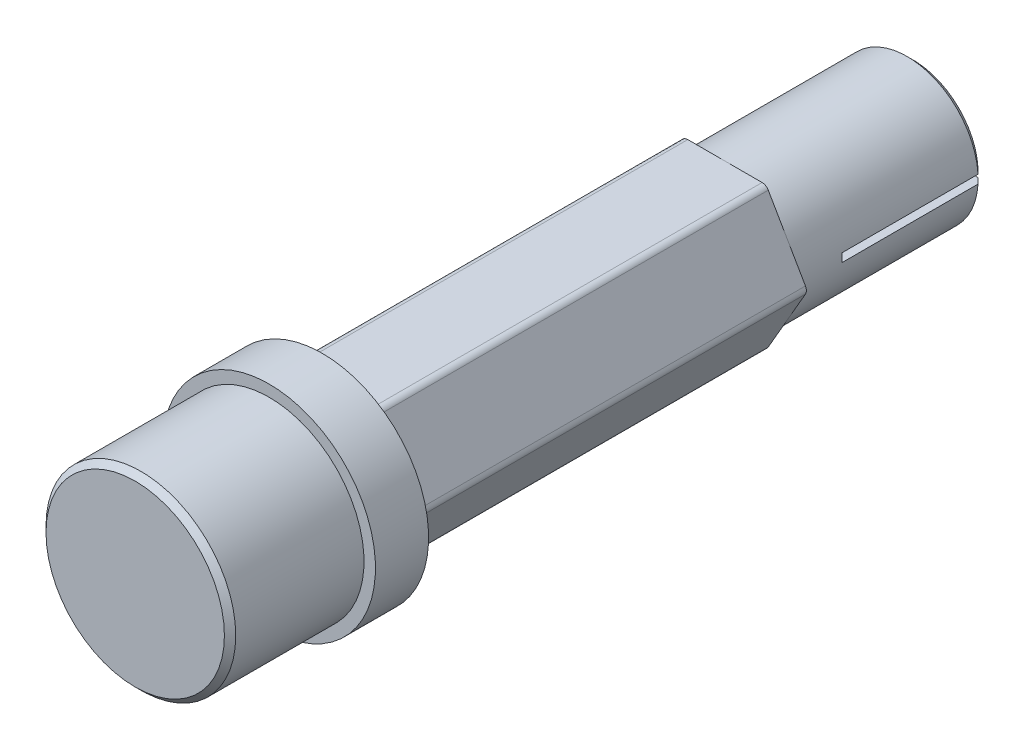
ISO-10303-21;
HEADER;
FILE_DESCRIPTION(('STEP AP214'),'2;1');
FILE_NAME('part.step','',(''),(''),'','','');
FILE_SCHEMA(('AUTOMOTIVE_DESIGN { 1 0 10303 214 1 1 1 1 }'));
ENDSEC;
DATA;
#1=APPLICATION_CONTEXT('core data for automotive mechanical design processes');
#2=APPLICATION_PROTOCOL_DEFINITION('international standard','automotive_design',2000,#1);
#3=PRODUCT_CONTEXT('',#1,'mechanical');
#4=PRODUCT('Part','Part','',(#3));
#5=PRODUCT_RELATED_PRODUCT_CATEGORY('part','',(#4));
#6=PRODUCT_DEFINITION_FORMATION('','',#4);
#7=PRODUCT_DEFINITION_CONTEXT('part definition',#1,'design');
#8=PRODUCT_DEFINITION('design','',#6,#7);
#9=PRODUCT_DEFINITION_SHAPE('','',#8);
#10=(LENGTH_UNIT() NAMED_UNIT(*) SI_UNIT(.MILLI.,.METRE.));
#11=(NAMED_UNIT(*) PLANE_ANGLE_UNIT() SI_UNIT($,.RADIAN.));
#12=(NAMED_UNIT(*) SI_UNIT($,.STERADIAN.) SOLID_ANGLE_UNIT());
#13=UNCERTAINTY_MEASURE_WITH_UNIT(LENGTH_MEASURE(1.E-05),#10,'distance_accuracy_value','');
#14=(GEOMETRIC_REPRESENTATION_CONTEXT(3) GLOBAL_UNCERTAINTY_ASSIGNED_CONTEXT((#13)) GLOBAL_UNIT_ASSIGNED_CONTEXT((#10,
#11,#12)) REPRESENTATION_CONTEXT('',''));
#15=CARTESIAN_POINT('',(0.,0.,0.));
#16=DIRECTION('',(0.,0.,1.));
#17=DIRECTION('',(1.,0.,0.));
#18=AXIS2_PLACEMENT_3D('',#15,#16,#17);
#19=CARTESIAN_POINT('',(0.,6.35000000000001,-69.67705));
#20=DIRECTION('',(0.,0.,-1.));
#21=DIRECTION('',(-1.,0.,0.));
#22=AXIS2_PLACEMENT_3D('',#19,#20,#21);
#23=PLANE('',#22);
#24=DIRECTION('',(-1.,0.,0.));
#25=VECTOR('',#24,1.);
#26=CARTESIAN_POINT('',(8.99873414352674,-0.381,-69.67705));
#27=LINE('',#26,#25);
#28=CARTESIAN_POINT('',(5.82956284810449,-0.381,-69.67705));
#29=VERTEX_POINT('',#28);
#30=CARTESIAN_POINT('',(3.15205710608168,-0.381,-69.67705));
#31=VERTEX_POINT('',#30);
#32=EDGE_CURVE('E213',#29,#31,#27,.T.);
#33=ORIENTED_EDGE('',*,*,#32,.F.);
#34=CARTESIAN_POINT('',(0.,0.,-69.67705));
#35=DIRECTION('',(0.,0.,-1.));
#36=DIRECTION('',(-1.,0.,0.));
#37=AXIS2_PLACEMENT_3D('',#34,#35,#36);
#38=CIRCLE('',#37,5.84200000000001);
#39=CARTESIAN_POINT('',(-5.82956284810449,-0.381,-69.67705));
#40=VERTEX_POINT('',#39);
#41=EDGE_CURVE('E344',#29,#40,#38,.T.);
#42=ORIENTED_EDGE('',*,*,#41,.T.);
#43=DIRECTION('',(-1.,0.,0.));
#44=VECTOR('',#43,1.);
#45=CARTESIAN_POINT('',(-3.15205710608168,-0.381,-69.67705));
#46=LINE('',#45,#44);
#47=CARTESIAN_POINT('',(-3.15205710608168,-0.381,-69.67705));
#48=VERTEX_POINT('',#47);
#49=EDGE_CURVE('E472',#48,#40,#46,.T.);
#50=ORIENTED_EDGE('',*,*,#49,.F.);
#51=CARTESIAN_POINT('',(0.,0.,-69.67705));
#52=DIRECTION('',(0.,0.,-1.));
#53=DIRECTION('',(-1.,0.,0.));
#54=AXIS2_PLACEMENT_3D('',#51,#52,#53);
#55=CIRCLE('',#54,3.17500000000001);
#56=EDGE_CURVE('E221',#31,#48,#55,.T.);
#57=ORIENTED_EDGE('',*,*,#56,.F.);
#58=EDGE_LOOP('',(#33,#42,#50,#57));
#59=FACE_BOUND('',#58,.T.);
#60=ADVANCED_FACE('F38',(#59),#23,.T.);
#61=CARTESIAN_POINT('',(0.,0.,0.));
#62=DIRECTION('',(0.,0.,1.));
#63=DIRECTION('',(1.,0.,0.));
#64=AXIS2_PLACEMENT_3D('',#61,#62,#63);
#65=PLANE('',#64);
#66=CARTESIAN_POINT('',(0.,0.,0.));
#67=DIRECTION('',(0.,0.,1.));
#68=DIRECTION('',(1.,0.,0.));
#69=AXIS2_PLACEMENT_3D('',#66,#67,#68);
#70=CIRCLE('',#69,7.992);
#71=CARTESIAN_POINT('',(7.992,0.,0.));
#72=VERTEX_POINT('',#71);
#73=EDGE_CURVE('E13',#72,#72,#70,.T.);
#74=ORIENTED_EDGE('',*,*,#73,.T.);
#75=EDGE_LOOP('',(#74));
#76=FACE_BOUND('',#75,.T.);
#77=ADVANCED_FACE('F425',(#76),#65,.T.);
#78=CARTESIAN_POINT('',(0.,0.,0.));
#79=DIRECTION('',(0.,0.,-1.));
#80=DIRECTION('',(-1.,0.,0.));
#81=AXIS2_PLACEMENT_3D('',#78,#79,#80);
#82=CYLINDRICAL_SURFACE('',#81,8.5);
#83=CARTESIAN_POINT('',(0.,0.,-0.508));
#84=DIRECTION('',(0.,0.,1.));
#85=DIRECTION('',(1.,0.,0.));
#86=AXIS2_PLACEMENT_3D('',#83,#84,#85);
#87=CIRCLE('',#86,8.5);
#88=CARTESIAN_POINT('',(8.5,0.,-0.508));
#89=VERTEX_POINT('',#88);
#90=EDGE_CURVE('E46',#89,#89,#87,.F.);
#91=ORIENTED_EDGE('',*,*,#90,.T.);
#92=EDGE_LOOP('',(#91));
#93=FACE_BOUND('',#92,.T.);
#94=CARTESIAN_POINT('',(0.,0.,-12.));
#95=DIRECTION('',(0.,0.,-1.));
#96=DIRECTION('',(-1.,0.,0.));
#97=AXIS2_PLACEMENT_3D('',#94,#95,#96);
#98=CIRCLE('',#97,8.5);
#99=CARTESIAN_POINT('',(-8.5,0.,-12.));
#100=VERTEX_POINT('',#99);
#101=EDGE_CURVE('E276',#100,#100,#98,.T.);
#102=ORIENTED_EDGE('',*,*,#101,.F.);
#103=EDGE_LOOP('',(#102));
#104=FACE_BOUND('',#103,.T.);
#105=ADVANCED_FACE('F421',(#93,#104),#82,.T.);
#106=CARTESIAN_POINT('',(0.,8.5,-12.));
#107=DIRECTION('',(0.,0.,1.));
#108=DIRECTION('',(1.,0.,0.));
#109=AXIS2_PLACEMENT_3D('',#106,#107,#108);
#110=PLANE('',#109);
#111=ORIENTED_EDGE('',*,*,#101,.T.);
#112=EDGE_LOOP('',(#111));
#113=FACE_BOUND('',#112,.T.);
#114=CARTESIAN_POINT('',(0.,0.,-12.));
#115=DIRECTION('',(0.,0.,-1.));
#116=DIRECTION('',(-1.,0.,0.));
#117=AXIS2_PLACEMENT_3D('',#114,#115,#116);
#118=CIRCLE('',#117,9.525);
#119=CARTESIAN_POINT('',(-9.525,0.,-12.));
#120=VERTEX_POINT('',#119);
#121=EDGE_CURVE('E273',#120,#120,#118,.T.);
#122=ORIENTED_EDGE('',*,*,#121,.F.);
#123=EDGE_LOOP('',(#122));
#124=FACE_BOUND('',#123,.T.);
#125=ADVANCED_FACE('F417',(#113,#124),#110,.T.);
#126=CARTESIAN_POINT('',(0.,0.,0.));
#127=DIRECTION('',(0.,0.,-1.));
#128=DIRECTION('',(-1.,0.,0.));
#129=AXIS2_PLACEMENT_3D('',#126,#127,#128);
#130=CYLINDRICAL_SURFACE('',#129,9.525);
#131=ORIENTED_EDGE('',*,*,#121,.T.);
#132=EDGE_LOOP('',(#131));
#133=FACE_BOUND('',#132,.T.);
#134=CARTESIAN_POINT('',(0.,0.,-16.7625));
#135=DIRECTION('',(0.,0.,-1.));
#136=DIRECTION('',(-1.,0.,0.));
#137=AXIS2_PLACEMENT_3D('',#134,#135,#136);
#138=CIRCLE('',#137,9.525);
#139=CARTESIAN_POINT('',(-9.525,0.,-16.7625));
#140=VERTEX_POINT('',#139);
#141=EDGE_CURVE('E268',#140,#140,#138,.T.);
#142=ORIENTED_EDGE('',*,*,#141,.F.);
#143=EDGE_LOOP('',(#142));
#144=FACE_BOUND('',#143,.T.);
#145=ADVANCED_FACE('F413',(#133,#144),#130,.T.);
#146=CARTESIAN_POINT('',(0.,9.525,-16.7625));
#147=DIRECTION('',(0.,0.,-1.));
#148=DIRECTION('',(-1.,0.,0.));
#149=AXIS2_PLACEMENT_3D('',#146,#147,#148);
#150=PLANE('',#149);
#151=ORIENTED_EDGE('',*,*,#141,.T.);
#152=EDGE_LOOP('',(#151));
#153=FACE_BOUND('',#152,.T.);
#154=DIRECTION('',(0.5,0.866025403784439,0.));
#155=VECTOR('',#154,1.);
#156=CARTESIAN_POINT('',(-7.3939401454254,0.,-16.7625));
#157=LINE('',#156,#155);
#158=CARTESIAN_POINT('',(-7.21063143495769,0.317500000000003,-16.7625));
#159=VERTEX_POINT('',#158);
#160=CARTESIAN_POINT('',(-3.8802787831804,6.08584,-16.7625));
#161=VERTEX_POINT('',#160);
#162=EDGE_CURVE('E246',#159,#161,#157,.T.);
#163=ORIENTED_EDGE('',*,*,#162,.F.);
#164=CARTESIAN_POINT('',(-6.66070530355457,0.,-16.7625));
#165=DIRECTION('',(0.,0.,-1.));
#166=DIRECTION('',(-1.,0.,0.));
#167=AXIS2_PLACEMENT_3D('',#164,#165,#166);
#168=CIRCLE('',#167,0.635);
#169=CARTESIAN_POINT('',(-7.21063143495769,-0.317499999999997,-16.7625));
#170=VERTEX_POINT('',#169);
#171=EDGE_CURVE('E325',#159,#170,#168,.F.);
#172=ORIENTED_EDGE('',*,*,#171,.T.);
#173=DIRECTION('',(-0.5,0.866025403784439,0.));
#174=VECTOR('',#173,1.);
#175=CARTESIAN_POINT('',(-3.6969700727127,-6.40334,-16.7625));
#176=LINE('',#175,#174);
#177=CARTESIAN_POINT('',(-3.88027878318041,-6.08584,-16.7625));
#178=VERTEX_POINT('',#177);
#179=EDGE_CURVE('E498',#178,#170,#176,.T.);
#180=ORIENTED_EDGE('',*,*,#179,.F.);
#181=CARTESIAN_POINT('',(-3.33035265177729,-5.76834,-16.7625));
#182=DIRECTION('',(0.,0.,-1.));
#183=DIRECTION('',(-1.,0.,0.));
#184=AXIS2_PLACEMENT_3D('',#181,#182,#183);
#185=CIRCLE('',#184,0.635);
#186=CARTESIAN_POINT('',(-3.33035265177729,-6.40334,-16.7625));
#187=VERTEX_POINT('',#186);
#188=EDGE_CURVE('E327',#178,#187,#185,.F.);
#189=ORIENTED_EDGE('',*,*,#188,.T.);
#190=DIRECTION('',(-1.,0.,0.));
#191=VECTOR('',#190,1.);
#192=CARTESIAN_POINT('',(3.6969700727127,-6.40334,-16.7625));
#193=LINE('',#192,#191);
#194=CARTESIAN_POINT('',(3.33035265177728,-6.40334,-16.7625));
#195=VERTEX_POINT('',#194);
#196=EDGE_CURVE('E259',#195,#187,#193,.T.);
#197=ORIENTED_EDGE('',*,*,#196,.F.);
#198=CARTESIAN_POINT('',(3.33035265177728,-5.76834,-16.7625));
#199=DIRECTION('',(0.,0.,-1.));
#200=DIRECTION('',(-1.,0.,0.));
#201=AXIS2_PLACEMENT_3D('',#198,#199,#200);
#202=CIRCLE('',#201,0.635);
#203=CARTESIAN_POINT('',(3.8802787831804,-6.08584,-16.7625));
#204=VERTEX_POINT('',#203);
#205=EDGE_CURVE('E329',#195,#204,#202,.F.);
#206=ORIENTED_EDGE('',*,*,#205,.T.);
#207=DIRECTION('',(-0.5,-0.866025403784438,0.));
#208=VECTOR('',#207,1.);
#209=CARTESIAN_POINT('',(7.3939401454254,0.,-16.7625));
#210=LINE('',#209,#208);
#211=CARTESIAN_POINT('',(7.21063143495769,-0.317500000000005,-16.7625));
#212=VERTEX_POINT('',#211);
#213=EDGE_CURVE('E255',#212,#204,#210,.T.);
#214=ORIENTED_EDGE('',*,*,#213,.F.);
#215=CARTESIAN_POINT('',(6.66070530355457,0.,-16.7625));
#216=DIRECTION('',(0.,0.,-1.));
#217=DIRECTION('',(-1.,0.,0.));
#218=AXIS2_PLACEMENT_3D('',#215,#216,#217);
#219=CIRCLE('',#218,0.635);
#220=CARTESIAN_POINT('',(7.21063143495769,0.317499999999994,-16.7625));
#221=VERTEX_POINT('',#220);
#222=EDGE_CURVE('E331',#212,#221,#219,.F.);
#223=ORIENTED_EDGE('',*,*,#222,.T.);
#224=DIRECTION('',(0.5,-0.866025403784439,0.));
#225=VECTOR('',#224,1.);
#226=CARTESIAN_POINT('',(3.6969700727127,6.40334,-16.7625));
#227=LINE('',#226,#225);
#228=CARTESIAN_POINT('',(3.88027878318041,6.08584,-16.7625));
#229=VERTEX_POINT('',#228);
#230=EDGE_CURVE('E252',#229,#221,#227,.T.);
#231=ORIENTED_EDGE('',*,*,#230,.F.);
#232=CARTESIAN_POINT('',(3.33035265177729,5.76834,-16.7625));
#233=DIRECTION('',(0.,0.,-1.));
#234=DIRECTION('',(-1.,0.,0.));
#235=AXIS2_PLACEMENT_3D('',#232,#233,#234);
#236=CIRCLE('',#235,0.635);
#237=CARTESIAN_POINT('',(3.33035265177729,6.40334,-16.7625));
#238=VERTEX_POINT('',#237);
#239=EDGE_CURVE('E321',#229,#238,#236,.F.);
#240=ORIENTED_EDGE('',*,*,#239,.T.);
#241=DIRECTION('',(1.,0.,0.));
#242=VECTOR('',#241,1.);
#243=CARTESIAN_POINT('',(-3.6969700727127,6.40334,-16.7625));
#244=LINE('',#243,#242);
#245=CARTESIAN_POINT('',(-3.33035265177728,6.40334,-16.7625));
#246=VERTEX_POINT('',#245);
#247=EDGE_CURVE('E249',#246,#238,#244,.T.);
#248=ORIENTED_EDGE('',*,*,#247,.F.);
#249=CARTESIAN_POINT('',(-3.33035265177728,5.76834,-16.7625));
#250=DIRECTION('',(0.,0.,-1.));
#251=DIRECTION('',(-1.,0.,0.));
#252=AXIS2_PLACEMENT_3D('',#249,#250,#251);
#253=CIRCLE('',#252,0.635);
#254=EDGE_CURVE('E323',#246,#161,#253,.F.);
#255=ORIENTED_EDGE('',*,*,#254,.T.);
#256=EDGE_LOOP('',(#163,#172,#180,#189,#197,#206,#214,#223,#231,#240,#248,#255));
#257=FACE_BOUND('',#256,.T.);
#258=ADVANCED_FACE('F371',(#153,#257),#150,.T.);
#259=CARTESIAN_POINT('',(-3.6969700727127,-6.40334,-80.0470260468395));
#260=DIRECTION('',(0.866025403784439,0.5,0.));
#261=DIRECTION('',(-0.5,0.866025403784439,0.));
#262=AXIS2_PLACEMENT_3D('',#259,#260,#261);
#263=PLANE('',#262);
#264=ORIENTED_EDGE('',*,*,#179,.T.);
#265=DIRECTION('',(0.,0.,1.));
#266=VECTOR('',#265,1.);
#267=CARTESIAN_POINT('',(-7.21063143495769,-0.317499999999997,-80.0470260468395));
#268=LINE('',#267,#266);
#269=CARTESIAN_POINT('',(-7.21063143495769,-0.317499999999995,-52.83685));
#270=VERTEX_POINT('',#269);
#271=EDGE_CURVE('E309',#170,#270,#268,.F.);
#272=ORIENTED_EDGE('',*,*,#271,.T.);
#273=DIRECTION('',(-0.5,0.866025403784439,0.));
#274=VECTOR('',#273,1.);
#275=CARTESIAN_POINT('',(-3.6969700727127,-6.40334,-52.83685));
#276=LINE('',#275,#274);
#277=CARTESIAN_POINT('',(-3.88027878318041,-6.08584,-52.83685));
#278=VERTEX_POINT('',#277);
#279=EDGE_CURVE('E495',#278,#270,#276,.T.);
#280=ORIENTED_EDGE('',*,*,#279,.F.);
#281=DIRECTION('',(0.,0.,1.));
#282=VECTOR('',#281,1.);
#283=CARTESIAN_POINT('',(-3.88027878318041,-6.08584,-80.0470260468395));
#284=LINE('',#283,#282);
#285=EDGE_CURVE('E306',#278,#178,#284,.T.);
#286=ORIENTED_EDGE('',*,*,#285,.T.);
#287=EDGE_LOOP('',(#264,#272,#280,#286));
#288=FACE_BOUND('',#287,.T.);
#289=ADVANCED_FACE('F367',(#288),#263,.F.);
#290=CARTESIAN_POINT('',(3.6969700727127,-6.40334,-80.0470260468395));
#291=DIRECTION('',(0.,1.,0.));
#292=DIRECTION('',(-1.,0.,0.));
#293=AXIS2_PLACEMENT_3D('',#290,#291,#292);
#294=PLANE('',#293);
#295=ORIENTED_EDGE('',*,*,#196,.T.);
#296=DIRECTION('',(0.,0.,1.));
#297=VECTOR('',#296,1.);
#298=CARTESIAN_POINT('',(-3.33035265177729,-6.40334,-80.0470260468395));
#299=LINE('',#298,#297);
#300=CARTESIAN_POINT('',(-3.33035265177729,-6.40334,-52.83685));
#301=VERTEX_POINT('',#300);
#302=EDGE_CURVE('E314',#187,#301,#299,.F.);
#303=ORIENTED_EDGE('',*,*,#302,.T.);
#304=DIRECTION('',(-1.,0.,0.));
#305=VECTOR('',#304,1.);
#306=CARTESIAN_POINT('',(3.6969700727127,-6.40334,-52.83685));
#307=LINE('',#306,#305);
#308=CARTESIAN_POINT('',(3.33035265177728,-6.40334,-52.83685));
#309=VERTEX_POINT('',#308);
#310=EDGE_CURVE('E231',#309,#301,#307,.T.);
#311=ORIENTED_EDGE('',*,*,#310,.F.);
#312=DIRECTION('',(0.,0.,1.));
#313=VECTOR('',#312,1.);
#314=CARTESIAN_POINT('',(3.33035265177728,-6.40334,-80.0470260468395));
#315=LINE('',#314,#313);
#316=EDGE_CURVE('E311',#309,#195,#315,.T.);
#317=ORIENTED_EDGE('',*,*,#316,.T.);
#318=EDGE_LOOP('',(#295,#303,#311,#317));
#319=FACE_BOUND('',#318,.T.);
#320=ADVANCED_FACE('F370',(#319),#294,.F.);
#321=CARTESIAN_POINT('',(7.3939401454254,0.,-80.0470260468395));
#322=DIRECTION('',(-0.866025403784438,0.5,0.));
#323=DIRECTION('',(-0.5,-0.866025403784439,0.));
#324=AXIS2_PLACEMENT_3D('',#321,#322,#323);
#325=PLANE('',#324);
#326=ORIENTED_EDGE('',*,*,#213,.T.);
#327=DIRECTION('',(0.,0.,1.));
#328=VECTOR('',#327,1.);
#329=CARTESIAN_POINT('',(3.8802787831804,-6.08584,-80.0470260468395));
#330=LINE('',#329,#328);
#331=CARTESIAN_POINT('',(3.8802787831804,-6.08584,-52.83685));
#332=VERTEX_POINT('',#331);
#333=EDGE_CURVE('E319',#204,#332,#330,.F.);
#334=ORIENTED_EDGE('',*,*,#333,.T.);
#335=DIRECTION('',(-0.5,-0.866025403784439,0.));
#336=VECTOR('',#335,1.);
#337=CARTESIAN_POINT('',(7.3939401454254,0.,-52.83685));
#338=LINE('',#337,#336);
#339=CARTESIAN_POINT('',(7.21063143495769,-0.317500000000005,-52.83685));
#340=VERTEX_POINT('',#339);
#341=EDGE_CURVE('E233',#340,#332,#338,.T.);
#342=ORIENTED_EDGE('',*,*,#341,.F.);
#343=DIRECTION('',(0.,0.,1.));
#344=VECTOR('',#343,1.);
#345=CARTESIAN_POINT('',(7.21063143495769,-0.317500000000005,-80.0470260468395));
#346=LINE('',#345,#344);
#347=EDGE_CURVE('E316',#340,#212,#346,.T.);
#348=ORIENTED_EDGE('',*,*,#347,.T.);
#349=EDGE_LOOP('',(#326,#334,#342,#348));
#350=FACE_BOUND('',#349,.T.);
#351=ADVANCED_FACE('F375',(#350),#325,.F.);
#352=CARTESIAN_POINT('',(3.6969700727127,6.40334,-80.0470260468395));
#353=DIRECTION('',(-0.866025403784439,-0.499999999999999,0.));
#354=DIRECTION('',(0.499999999999999,-0.866025403784439,0.));
#355=AXIS2_PLACEMENT_3D('',#352,#353,#354);
#356=PLANE('',#355);
#357=DIRECTION('',(0.499999999999999,-0.866025403784439,0.));
#358=VECTOR('',#357,1.);
#359=CARTESIAN_POINT('',(3.6969700727127,6.40334,-52.83685));
#360=LINE('',#359,#358);
#361=CARTESIAN_POINT('',(3.88027878318041,6.08584,-52.83685));
#362=VERTEX_POINT('',#361);
#363=CARTESIAN_POINT('',(7.21063143495769,0.317499999999994,-52.83685));
#364=VERTEX_POINT('',#363);
#365=EDGE_CURVE('E237',#362,#364,#360,.T.);
#366=ORIENTED_EDGE('',*,*,#365,.F.);
#367=DIRECTION('',(0.,0.,1.));
#368=VECTOR('',#367,1.);
#369=CARTESIAN_POINT('',(3.88027878318041,6.08584,-80.0470260468395));
#370=LINE('',#369,#368);
#371=EDGE_CURVE('E281',#362,#229,#370,.T.);
#372=ORIENTED_EDGE('',*,*,#371,.T.);
#373=ORIENTED_EDGE('',*,*,#230,.T.);
#374=DIRECTION('',(0.,0.,1.));
#375=VECTOR('',#374,1.);
#376=CARTESIAN_POINT('',(7.21063143495769,0.317499999999994,-80.0470260468395));
#377=LINE('',#376,#375);
#378=EDGE_CURVE('E279',#221,#364,#377,.F.);
#379=ORIENTED_EDGE('',*,*,#378,.T.);
#380=EDGE_LOOP('',(#366,#372,#373,#379));
#381=FACE_BOUND('',#380,.T.);
#382=ADVANCED_FACE('F379',(#381),#356,.F.);
#383=CARTESIAN_POINT('',(-3.6969700727127,6.40334,-80.0470260468395));
#384=DIRECTION('',(0.,-1.,0.));
#385=DIRECTION('',(1.,0.,0.));
#386=AXIS2_PLACEMENT_3D('',#383,#384,#385);
#387=PLANE('',#386);
#388=ORIENTED_EDGE('',*,*,#247,.T.);
#389=DIRECTION('',(0.,0.,1.));
#390=VECTOR('',#389,1.);
#391=CARTESIAN_POINT('',(3.33035265177729,6.40334,-80.0470260468395));
#392=LINE('',#391,#390);
#393=CARTESIAN_POINT('',(3.33035265177729,6.40334,-52.83685));
#394=VERTEX_POINT('',#393);
#395=EDGE_CURVE('E287',#238,#394,#392,.F.);
#396=ORIENTED_EDGE('',*,*,#395,.T.);
#397=DIRECTION('',(1.,0.,0.));
#398=VECTOR('',#397,1.);
#399=CARTESIAN_POINT('',(-3.6969700727127,6.40334,-52.83685));
#400=LINE('',#399,#398);
#401=CARTESIAN_POINT('',(-3.33035265177728,6.40334,-52.83685));
#402=VERTEX_POINT('',#401);
#403=EDGE_CURVE('E240',#402,#394,#400,.T.);
#404=ORIENTED_EDGE('',*,*,#403,.F.);
#405=DIRECTION('',(0.,0.,1.));
#406=VECTOR('',#405,1.);
#407=CARTESIAN_POINT('',(-3.33035265177728,6.40334,-80.0470260468395));
#408=LINE('',#407,#406);
#409=EDGE_CURVE('E284',#402,#246,#408,.T.);
#410=ORIENTED_EDGE('',*,*,#409,.T.);
#411=EDGE_LOOP('',(#388,#396,#404,#410));
#412=FACE_BOUND('',#411,.T.);
#413=ADVANCED_FACE('F383',(#412),#387,.F.);
#414=CARTESIAN_POINT('',(-7.3939401454254,0.,-80.0470260468395));
#415=DIRECTION('',(0.866025403784438,-0.5,0.));
#416=DIRECTION('',(0.5,0.866025403784439,0.));
#417=AXIS2_PLACEMENT_3D('',#414,#415,#416);
#418=PLANE('',#417);
#419=ORIENTED_EDGE('',*,*,#162,.T.);
#420=DIRECTION('',(0.,0.,1.));
#421=VECTOR('',#420,1.);
#422=CARTESIAN_POINT('',(-3.8802787831804,6.08584,-80.0470260468395));
#423=LINE('',#422,#421);
#424=CARTESIAN_POINT('',(-3.8802787831804,6.08584,-52.83685));
#425=VERTEX_POINT('',#424);
#426=EDGE_CURVE('E304',#161,#425,#423,.F.);
#427=ORIENTED_EDGE('',*,*,#426,.T.);
#428=DIRECTION('',(0.5,0.866025403784439,0.));
#429=VECTOR('',#428,1.);
#430=CARTESIAN_POINT('',(-7.3939401454254,0.,-52.83685));
#431=LINE('',#430,#429);
#432=CARTESIAN_POINT('',(-7.21063143495769,0.317500000000003,-52.83685));
#433=VERTEX_POINT('',#432);
#434=EDGE_CURVE('E243',#433,#425,#431,.T.);
#435=ORIENTED_EDGE('',*,*,#434,.F.);
#436=DIRECTION('',(0.,0.,1.));
#437=VECTOR('',#436,1.);
#438=CARTESIAN_POINT('',(-7.21063143495769,0.317500000000003,-80.0470260468395));
#439=LINE('',#438,#437);
#440=EDGE_CURVE('E301',#433,#159,#439,.T.);
#441=ORIENTED_EDGE('',*,*,#440,.T.);
#442=EDGE_LOOP('',(#419,#427,#435,#441));
#443=FACE_BOUND('',#442,.T.);
#444=ADVANCED_FACE('F387',(#443),#418,.F.);
#445=CARTESIAN_POINT('',(0.,0.,-52.5293175345875));
#446=DIRECTION('',(0.,0.,-1.));
#447=DIRECTION('',(-1.,0.,0.));
#448=AXIS2_PLACEMENT_3D('',#445,#446,#447);
#449=CONICAL_SURFACE('',#448,0.,1.02974425867666);
#450=CARTESIAN_POINT('',(0.,0.,-54.43705));
#451=DIRECTION('',(0.,0.,-1.));
#452=DIRECTION('',(-1.,0.,0.));
#453=AXIS2_PLACEMENT_3D('',#450,#451,#452);
#454=CIRCLE('',#453,3.17500000000001);
#455=CARTESIAN_POINT('',(-3.17500000000001,0.,-54.43705));
#456=VERTEX_POINT('',#455);
#457=EDGE_CURVE('E493',#456,#456,#454,.T.);
#458=ORIENTED_EDGE('',*,*,#457,.T.);
#459=EDGE_LOOP('',(#458));
#460=FACE_BOUND('',#459,.T.);
#461=CARTESIAN_POINT('',(0.,0.,-52.5293175345875));
#462=VERTEX_POINT('',#461);
#463=VERTEX_LOOP('',#462);
#464=FACE_BOUND('',#463,.T.);
#465=ADVANCED_FACE('F391',(#460,#464),#449,.F.);
#466=CARTESIAN_POINT('',(0.,0.,0.));
#467=DIRECTION('',(0.,0.,-1.));
#468=DIRECTION('',(-1.,0.,0.));
#469=AXIS2_PLACEMENT_3D('',#466,#467,#468);
#470=CYLINDRICAL_SURFACE('',#469,3.17500000000001);
#471=DIRECTION('',(0.,0.,-1.));
#472=VECTOR('',#471,1.);
#473=CARTESIAN_POINT('',(3.15205710608168,0.380999999999997,-56.97705));
#474=LINE('',#473,#472);
#475=CARTESIAN_POINT('',(3.15205710608168,0.380999999999997,-56.97705));
#476=VERTEX_POINT('',#475);
#477=CARTESIAN_POINT('',(3.15205710608168,0.380999999999997,-69.67705));
#478=VERTEX_POINT('',#477);
#479=EDGE_CURVE('E225',#476,#478,#474,.T.);
#480=ORIENTED_EDGE('',*,*,#479,.F.);
#481=CARTESIAN_POINT('',(0.,0.,-56.97705));
#482=DIRECTION('',(0.,0.,-1.));
#483=DIRECTION('',(-1.,0.,0.));
#484=AXIS2_PLACEMENT_3D('',#481,#482,#483);
#485=CIRCLE('',#484,3.17500000000001);
#486=CARTESIAN_POINT('',(3.15205710608168,-0.381,-56.97705));
#487=VERTEX_POINT('',#486);
#488=EDGE_CURVE('E203',#476,#487,#485,.T.);
#489=ORIENTED_EDGE('',*,*,#488,.T.);
#490=DIRECTION('',(0.,0.,-1.));
#491=VECTOR('',#490,1.);
#492=CARTESIAN_POINT('',(3.15205710608168,-0.381,-56.97705));
#493=LINE('',#492,#491);
#494=EDGE_CURVE('E204',#487,#31,#493,.T.);
#495=ORIENTED_EDGE('',*,*,#494,.T.);
#496=ORIENTED_EDGE('',*,*,#56,.T.);
#497=DIRECTION('',(0.,0.,-1.));
#498=VECTOR('',#497,1.);
#499=CARTESIAN_POINT('',(-3.15205710608168,-0.381,-56.97705));
#500=LINE('',#499,#498);
#501=CARTESIAN_POINT('',(-3.15205710608168,-0.381,-56.97705));
#502=VERTEX_POINT('',#501);
#503=EDGE_CURVE('E209',#502,#48,#500,.T.);
#504=ORIENTED_EDGE('',*,*,#503,.F.);
#505=CARTESIAN_POINT('',(-3.15205710608168,0.380999999999999,-56.97705));
#506=VERTEX_POINT('',#505);
#507=EDGE_CURVE('E192',#502,#506,#485,.T.);
#508=ORIENTED_EDGE('',*,*,#507,.T.);
#509=DIRECTION('',(0.,0.,-1.));
#510=VECTOR('',#509,1.);
#511=CARTESIAN_POINT('',(-3.15205710608168,0.380999999999999,-56.97705));
#512=LINE('',#511,#510);
#513=CARTESIAN_POINT('',(-3.15205710608168,0.380999999999999,-69.67705));
#514=VERTEX_POINT('',#513);
#515=EDGE_CURVE('E222',#506,#514,#512,.T.);
#516=ORIENTED_EDGE('',*,*,#515,.T.);
#517=EDGE_CURVE('E269',#514,#478,#55,.T.);
#518=ORIENTED_EDGE('',*,*,#517,.T.);
#519=EDGE_LOOP('',(#480,#489,#495,#496,#504,#508,#516,#518));
#520=FACE_BOUND('',#519,.T.);
#521=ORIENTED_EDGE('',*,*,#457,.F.);
#522=EDGE_LOOP('',(#521));
#523=FACE_BOUND('',#522,.T.);
#524=ADVANCED_FACE('F217',(#520,#523),#470,.F.);
#525=DIRECTION('',(1.,0.,0.));
#526=VECTOR('',#525,1.);
#527=CARTESIAN_POINT('',(-3.15205710608168,0.380999999999999,-69.67705));
#528=LINE('',#527,#526);
#529=CARTESIAN_POINT('',(-5.82956284810449,0.380999999999999,-69.67705));
#530=VERTEX_POINT('',#529);
#531=EDGE_CURVE('E481',#530,#514,#528,.T.);
#532=ORIENTED_EDGE('',*,*,#531,.F.);
#533=CARTESIAN_POINT('',(0.,0.,-69.67705));
#534=DIRECTION('',(0.,0.,-1.));
#535=DIRECTION('',(-1.,0.,0.));
#536=AXIS2_PLACEMENT_3D('',#533,#534,#535);
#537=CIRCLE('',#536,5.84200000000001);
#538=CARTESIAN_POINT('',(5.82956284810449,0.380999999999996,-69.67705));
#539=VERTEX_POINT('',#538);
#540=EDGE_CURVE('E492',#530,#539,#537,.T.);
#541=ORIENTED_EDGE('',*,*,#540,.T.);
#542=DIRECTION('',(1.,0.,0.));
#543=VECTOR('',#542,1.);
#544=CARTESIAN_POINT('',(8.99873414352674,0.380999999999996,-69.67705));
#545=LINE('',#544,#543);
#546=EDGE_CURVE('E465',#478,#539,#545,.T.);
#547=ORIENTED_EDGE('',*,*,#546,.F.);
#548=ORIENTED_EDGE('',*,*,#517,.F.);
#549=EDGE_LOOP('',(#532,#541,#547,#548));
#550=FACE_BOUND('',#549,.T.);
#551=ADVANCED_FACE('F398',(#550),#23,.T.);
#552=CARTESIAN_POINT('',(0.,0.,0.));
#553=DIRECTION('',(0.,0.,-1.));
#554=DIRECTION('',(-1.,0.,0.));
#555=AXIS2_PLACEMENT_3D('',#552,#553,#554);
#556=CYLINDRICAL_SURFACE('',#555,6.35000000000001);
#557=DIRECTION('',(0.,0.,-1.));
#558=VECTOR('',#557,1.);
#559=CARTESIAN_POINT('',(-6.33855969444164,-0.381,0.));
#560=LINE('',#559,#558);
#561=CARTESIAN_POINT('',(-6.33855969444164,-0.381,-69.16905));
#562=VERTEX_POINT('',#561);
#563=CARTESIAN_POINT('',(-6.33855969444164,-0.381,-56.97705));
#564=VERTEX_POINT('',#563);
#565=EDGE_CURVE('E212',#562,#564,#560,.F.);
#566=ORIENTED_EDGE('',*,*,#565,.F.);
#567=CARTESIAN_POINT('',(0.,0.,-69.16905));
#568=DIRECTION('',(0.,0.,-1.));
#569=DIRECTION('',(-1.,0.,0.));
#570=AXIS2_PLACEMENT_3D('',#567,#568,#569);
#571=CIRCLE('',#570,6.35000000000001);
#572=CARTESIAN_POINT('',(6.33855969444164,-0.381,-69.16905));
#573=VERTEX_POINT('',#572);
#574=EDGE_CURVE('E471',#562,#573,#571,.F.);
#575=ORIENTED_EDGE('',*,*,#574,.T.);
#576=DIRECTION('',(0.,0.,-1.));
#577=VECTOR('',#576,1.);
#578=CARTESIAN_POINT('',(6.33855969444164,-0.381,0.));
#579=LINE('',#578,#577);
#580=CARTESIAN_POINT('',(6.33855969444164,-0.381,-56.97705));
#581=VERTEX_POINT('',#580);
#582=EDGE_CURVE('E341',#581,#573,#579,.T.);
#583=ORIENTED_EDGE('',*,*,#582,.F.);
#584=CARTESIAN_POINT('',(0.,0.,-56.97705));
#585=DIRECTION('',(0.,0.,-1.));
#586=DIRECTION('',(-1.,0.,0.));
#587=AXIS2_PLACEMENT_3D('',#584,#585,#586);
#588=CIRCLE('',#587,6.35000000000001);
#589=CARTESIAN_POINT('',(6.33855969444164,0.380999999999996,-56.97705));
#590=VERTEX_POINT('',#589);
#591=EDGE_CURVE('E335',#581,#590,#588,.F.);
#592=ORIENTED_EDGE('',*,*,#591,.T.);
#593=DIRECTION('',(0.,0.,-1.));
#594=VECTOR('',#593,1.);
#595=CARTESIAN_POINT('',(6.33855969444164,0.380999999999996,0.));
#596=LINE('',#595,#594);
#597=CARTESIAN_POINT('',(6.33855969444164,0.380999999999996,-69.16905));
#598=VERTEX_POINT('',#597);
#599=EDGE_CURVE('E339',#598,#590,#596,.F.);
#600=ORIENTED_EDGE('',*,*,#599,.F.);
#601=CARTESIAN_POINT('',(0.,0.,-69.16905));
#602=DIRECTION('',(0.,0.,-1.));
#603=DIRECTION('',(-1.,0.,0.));
#604=AXIS2_PLACEMENT_3D('',#601,#602,#603);
#605=CIRCLE('',#604,6.35000000000001);
#606=CARTESIAN_POINT('',(-6.33855969444164,0.380999999999999,-69.16905));
#607=VERTEX_POINT('',#606);
#608=EDGE_CURVE('E355',#598,#607,#605,.F.);
#609=ORIENTED_EDGE('',*,*,#608,.T.);
#610=DIRECTION('',(0.,0.,-1.));
#611=VECTOR('',#610,1.);
#612=CARTESIAN_POINT('',(-6.33855969444164,0.380999999999999,0.));
#613=LINE('',#612,#611);
#614=CARTESIAN_POINT('',(-6.33855969444164,0.380999999999999,-56.97705));
#615=VERTEX_POINT('',#614);
#616=EDGE_CURVE('E337',#615,#607,#613,.T.);
#617=ORIENTED_EDGE('',*,*,#616,.F.);
#618=EDGE_CURVE('E333',#615,#564,#588,.F.);
#619=ORIENTED_EDGE('',*,*,#618,.T.);
#620=EDGE_LOOP('',(#566,#575,#583,#592,#600,#609,#617,#619));
#621=FACE_BOUND('',#620,.T.);
#622=CARTESIAN_POINT('',(0.,0.,-52.83685));
#623=DIRECTION('',(0.,0.,-1.));
#624=DIRECTION('',(-1.,0.,0.));
#625=AXIS2_PLACEMENT_3D('',#622,#623,#624);
#626=CIRCLE('',#625,6.35000000000001);
#627=CARTESIAN_POINT('',(-6.35000000000001,0.,-52.83685));
#628=VERTEX_POINT('',#627);
#629=EDGE_CURVE('E263',#628,#628,#626,.T.);
#630=ORIENTED_EDGE('',*,*,#629,.T.);
#631=EDGE_LOOP('',(#630));
#632=FACE_BOUND('',#631,.T.);
#633=ADVANCED_FACE('F401',(#621,#632),#556,.T.);
#634=CARTESIAN_POINT('',(0.,7.62,-52.83685));
#635=DIRECTION('',(0.,0.,-1.));
#636=DIRECTION('',(-1.,0.,0.));
#637=AXIS2_PLACEMENT_3D('',#634,#635,#636);
#638=PLANE('',#637);
#639=ORIENTED_EDGE('',*,*,#403,.T.);
#640=CARTESIAN_POINT('',(3.33035265177729,5.76834,-52.83685));
#641=DIRECTION('',(0.,0.,-1.));
#642=DIRECTION('',(-1.,0.,0.));
#643=AXIS2_PLACEMENT_3D('',#640,#641,#642);
#644=CIRCLE('',#643,0.635);
#645=EDGE_CURVE('E299',#394,#362,#644,.T.);
#646=ORIENTED_EDGE('',*,*,#645,.T.);
#647=ORIENTED_EDGE('',*,*,#365,.T.);
#648=CARTESIAN_POINT('',(6.66070530355457,0.,-52.83685));
#649=DIRECTION('',(0.,0.,-1.));
#650=DIRECTION('',(-1.,0.,0.));
#651=AXIS2_PLACEMENT_3D('',#648,#649,#650);
#652=CIRCLE('',#651,0.635);
#653=EDGE_CURVE('E289',#364,#340,#652,.T.);
#654=ORIENTED_EDGE('',*,*,#653,.T.);
#655=ORIENTED_EDGE('',*,*,#341,.T.);
#656=CARTESIAN_POINT('',(3.33035265177728,-5.76834,-52.83685));
#657=DIRECTION('',(0.,0.,-1.));
#658=DIRECTION('',(-1.,0.,0.));
#659=AXIS2_PLACEMENT_3D('',#656,#657,#658);
#660=CIRCLE('',#659,0.635);
#661=EDGE_CURVE('E291',#332,#309,#660,.T.);
#662=ORIENTED_EDGE('',*,*,#661,.T.);
#663=ORIENTED_EDGE('',*,*,#310,.T.);
#664=CARTESIAN_POINT('',(-3.33035265177729,-5.76834,-52.83685));
#665=DIRECTION('',(0.,0.,-1.));
#666=DIRECTION('',(-1.,0.,0.));
#667=AXIS2_PLACEMENT_3D('',#664,#665,#666);
#668=CIRCLE('',#667,0.635);
#669=EDGE_CURVE('E293',#301,#278,#668,.T.);
#670=ORIENTED_EDGE('',*,*,#669,.T.);
#671=ORIENTED_EDGE('',*,*,#279,.T.);
#672=CARTESIAN_POINT('',(-6.66070530355457,0.,-52.83685));
#673=DIRECTION('',(0.,0.,-1.));
#674=DIRECTION('',(-1.,0.,0.));
#675=AXIS2_PLACEMENT_3D('',#672,#673,#674);
#676=CIRCLE('',#675,0.635);
#677=EDGE_CURVE('E295',#270,#433,#676,.T.);
#678=ORIENTED_EDGE('',*,*,#677,.T.);
#679=ORIENTED_EDGE('',*,*,#434,.T.);
#680=CARTESIAN_POINT('',(-3.33035265177728,5.76834,-52.83685));
#681=DIRECTION('',(0.,0.,-1.));
#682=DIRECTION('',(-1.,0.,0.));
#683=AXIS2_PLACEMENT_3D('',#680,#681,#682);
#684=CIRCLE('',#683,0.635);
#685=EDGE_CURVE('E297',#425,#402,#684,.T.);
#686=ORIENTED_EDGE('',*,*,#685,.T.);
#687=EDGE_LOOP('',(#639,#646,#647,#654,#655,#662,#663,#670,#671,#678,#679,#686));
#688=FACE_BOUND('',#687,.T.);
#689=ORIENTED_EDGE('',*,*,#629,.F.);
#690=EDGE_LOOP('',(#689));
#691=FACE_BOUND('',#690,.T.);
#692=ADVANCED_FACE('F405',(#688,#691),#638,.T.);
#693=CARTESIAN_POINT('',(3.33035265177729,5.76834,-80.0470260468395));
#694=DIRECTION('',(0.,0.,1.));
#695=DIRECTION('',(1.,0.,0.));
#696=AXIS2_PLACEMENT_3D('',#693,#694,#695);
#697=CYLINDRICAL_SURFACE('',#696,0.635);
#698=ORIENTED_EDGE('',*,*,#645,.F.);
#699=ORIENTED_EDGE('',*,*,#395,.F.);
#700=ORIENTED_EDGE('',*,*,#239,.F.);
#701=ORIENTED_EDGE('',*,*,#371,.F.);
#702=EDGE_LOOP('',(#698,#699,#700,#701));
#703=FACE_BOUND('',#702,.T.);
#704=ADVANCED_FACE('F409',(#703),#697,.T.);
#705=CARTESIAN_POINT('',(-3.33035265177728,5.76834,-80.0470260468395));
#706=DIRECTION('',(0.,0.,1.));
#707=DIRECTION('',(1.,0.,0.));
#708=AXIS2_PLACEMENT_3D('',#705,#706,#707);
#709=CYLINDRICAL_SURFACE('',#708,0.635);
#710=ORIENTED_EDGE('',*,*,#685,.F.);
#711=ORIENTED_EDGE('',*,*,#426,.F.);
#712=ORIENTED_EDGE('',*,*,#254,.F.);
#713=ORIENTED_EDGE('',*,*,#409,.F.);
#714=EDGE_LOOP('',(#710,#711,#712,#713));
#715=FACE_BOUND('',#714,.T.);
#716=ADVANCED_FACE('F432',(#715),#709,.T.);
#717=CARTESIAN_POINT('',(-6.66070530355457,0.,-80.0470260468395));
#718=DIRECTION('',(0.,0.,1.));
#719=DIRECTION('',(1.,0.,0.));
#720=AXIS2_PLACEMENT_3D('',#717,#718,#719);
#721=CYLINDRICAL_SURFACE('',#720,0.635);
#722=ORIENTED_EDGE('',*,*,#677,.F.);
#723=ORIENTED_EDGE('',*,*,#271,.F.);
#724=ORIENTED_EDGE('',*,*,#171,.F.);
#725=ORIENTED_EDGE('',*,*,#440,.F.);
#726=EDGE_LOOP('',(#722,#723,#724,#725));
#727=FACE_BOUND('',#726,.T.);
#728=ADVANCED_FACE('F436',(#727),#721,.T.);
#729=CARTESIAN_POINT('',(-3.33035265177729,-5.76834,-80.0470260468395));
#730=DIRECTION('',(0.,0.,1.));
#731=DIRECTION('',(1.,0.,0.));
#732=AXIS2_PLACEMENT_3D('',#729,#730,#731);
#733=CYLINDRICAL_SURFACE('',#732,0.635);
#734=ORIENTED_EDGE('',*,*,#669,.F.);
#735=ORIENTED_EDGE('',*,*,#302,.F.);
#736=ORIENTED_EDGE('',*,*,#188,.F.);
#737=ORIENTED_EDGE('',*,*,#285,.F.);
#738=EDGE_LOOP('',(#734,#735,#736,#737));
#739=FACE_BOUND('',#738,.T.);
#740=ADVANCED_FACE('F440',(#739),#733,.T.);
#741=CARTESIAN_POINT('',(3.33035265177728,-5.76834,-80.0470260468395));
#742=DIRECTION('',(0.,0.,1.));
#743=DIRECTION('',(1.,0.,0.));
#744=AXIS2_PLACEMENT_3D('',#741,#742,#743);
#745=CYLINDRICAL_SURFACE('',#744,0.635);
#746=ORIENTED_EDGE('',*,*,#661,.F.);
#747=ORIENTED_EDGE('',*,*,#333,.F.);
#748=ORIENTED_EDGE('',*,*,#205,.F.);
#749=ORIENTED_EDGE('',*,*,#316,.F.);
#750=EDGE_LOOP('',(#746,#747,#748,#749));
#751=FACE_BOUND('',#750,.T.);
#752=ADVANCED_FACE('F444',(#751),#745,.T.);
#753=CARTESIAN_POINT('',(6.66070530355457,0.,-80.0470260468395));
#754=DIRECTION('',(0.,0.,1.));
#755=DIRECTION('',(1.,0.,0.));
#756=AXIS2_PLACEMENT_3D('',#753,#754,#755);
#757=CYLINDRICAL_SURFACE('',#756,0.635);
#758=ORIENTED_EDGE('',*,*,#653,.F.);
#759=ORIENTED_EDGE('',*,*,#378,.F.);
#760=ORIENTED_EDGE('',*,*,#222,.F.);
#761=ORIENTED_EDGE('',*,*,#347,.F.);
#762=EDGE_LOOP('',(#758,#759,#760,#761));
#763=FACE_BOUND('',#762,.T.);
#764=ADVANCED_FACE('F447',(#763),#757,.T.);
#765=CARTESIAN_POINT('',(0.,0.,-56.97705));
#766=DIRECTION('',(0.,0.,-1.));
#767=DIRECTION('',(-1.,0.,0.));
#768=AXIS2_PLACEMENT_3D('',#765,#766,#767);
#769=PLANE('',#768);
#770=DIRECTION('',(-1.,0.,0.));
#771=VECTOR('',#770,1.);
#772=CARTESIAN_POINT('',(-3.15205710608168,-0.381,-56.97705));
#773=LINE('',#772,#771);
#774=EDGE_CURVE('E195',#502,#564,#773,.T.);
#775=ORIENTED_EDGE('',*,*,#774,.T.);
#776=ORIENTED_EDGE('',*,*,#618,.F.);
#777=DIRECTION('',(1.,0.,0.));
#778=VECTOR('',#777,1.);
#779=CARTESIAN_POINT('',(-3.15205710608168,0.380999999999999,-56.97705));
#780=LINE('',#779,#778);
#781=EDGE_CURVE('E198',#615,#506,#780,.T.);
#782=ORIENTED_EDGE('',*,*,#781,.T.);
#783=ORIENTED_EDGE('',*,*,#507,.F.);
#784=EDGE_LOOP('',(#775,#776,#782,#783));
#785=FACE_BOUND('',#784,.T.);
#786=ADVANCED_FACE('F194',(#785),#769,.T.);
#787=CARTESIAN_POINT('',(-3.15205710608168,-0.381,-56.97705));
#788=DIRECTION('',(0.,-1.,0.));
#789=DIRECTION('',(0.,0.,-1.));
#790=AXIS2_PLACEMENT_3D('',#787,#788,#789);
#791=PLANE('',#790);
#792=ORIENTED_EDGE('',*,*,#49,.T.);
#793=CARTESIAN_POINT('',(-5.82956284810449,-0.381,-69.67705));
#794=CARTESIAN_POINT('',(-5.91440258515602,-0.381,-69.5923902762476));
#795=CARTESIAN_POINT('',(-5.99923885754618,-0.381,-69.5077270810351));
#796=CARTESIAN_POINT('',(-6.16890447299189,-0.381,-69.3383937477017));
#797=CARTESIAN_POINT('',(-6.25373381604746,-0.381,-69.2537236095809));
#798=CARTESIAN_POINT('',(-6.33855969444164,-0.381,-69.16905));
#799=B_SPLINE_CURVE_WITH_KNOTS('',3,(#793,#794,#795,#796,#797,#798),.UNSPECIFIED.,.F.,.F.,(4,2,
4),(0.,0.3595628562989,0.719125712547623),.UNSPECIFIED.);
#800=EDGE_CURVE('E347',#40,#562,#799,.T.);
#801=ORIENTED_EDGE('',*,*,#800,.T.);
#802=ORIENTED_EDGE('',*,*,#565,.T.);
#803=ORIENTED_EDGE('',*,*,#774,.F.);
#804=ORIENTED_EDGE('',*,*,#503,.T.);
#805=EDGE_LOOP('',(#792,#801,#802,#803,#804));
#806=FACE_BOUND('',#805,.T.);
#807=ADVANCED_FACE('F208',(#806),#791,.F.);
#808=CARTESIAN_POINT('',(-3.15205710608168,0.380999999999999,-56.97705));
#809=DIRECTION('',(0.,1.,0.));
#810=DIRECTION('',(-1.,0.,0.));
#811=AXIS2_PLACEMENT_3D('',#808,#809,#810);
#812=PLANE('',#811);
#813=ORIENTED_EDGE('',*,*,#616,.T.);
#814=CARTESIAN_POINT('',(-6.33855969444164,0.380999999999999,-69.16905));
#815=CARTESIAN_POINT('',(-6.25373381604745,0.380999999999999,-69.2537236095809));
#816=CARTESIAN_POINT('',(-6.16890447299189,0.380999999999999,-69.3383937477017));
#817=CARTESIAN_POINT('',(-5.99923885754618,0.380999999999999,-69.5077270810351));
#818=CARTESIAN_POINT('',(-5.91440258515602,0.380999999999999,-69.5923902762476));
#819=CARTESIAN_POINT('',(-5.82956284810448,0.380999999999999,-69.67705));
#820=B_SPLINE_CURVE_WITH_KNOTS('',3,(#814,#815,#816,#817,#818,#819),.UNSPECIFIED.,.F.,.F.,(4,2,
4),(0.,0.359562856248722,0.719125712547623),.UNSPECIFIED.);
#821=EDGE_CURVE('E53',#607,#530,#820,.T.);
#822=ORIENTED_EDGE('',*,*,#821,.T.);
#823=ORIENTED_EDGE('',*,*,#531,.T.);
#824=ORIENTED_EDGE('',*,*,#515,.F.);
#825=ORIENTED_EDGE('',*,*,#781,.F.);
#826=EDGE_LOOP('',(#813,#822,#823,#824,#825));
#827=FACE_BOUND('',#826,.T.);
#828=ADVANCED_FACE('F364',(#827),#812,.F.);
#829=DIRECTION('',(1.,0.,0.));
#830=VECTOR('',#829,1.);
#831=CARTESIAN_POINT('',(8.99873414352674,0.380999999999996,-56.97705));
#832=LINE('',#831,#830);
#833=EDGE_CURVE('E227',#476,#590,#832,.T.);
#834=ORIENTED_EDGE('',*,*,#833,.T.);
#835=ORIENTED_EDGE('',*,*,#591,.F.);
#836=DIRECTION('',(-1.,0.,0.));
#837=VECTOR('',#836,1.);
#838=CARTESIAN_POINT('',(8.99873414352674,-0.381,-56.97705));
#839=LINE('',#838,#837);
#840=EDGE_CURVE('E223',#581,#487,#839,.T.);
#841=ORIENTED_EDGE('',*,*,#840,.T.);
#842=ORIENTED_EDGE('',*,*,#488,.F.);
#843=EDGE_LOOP('',(#834,#835,#841,#842));
#844=FACE_BOUND('',#843,.T.);
#845=ADVANCED_FACE('F455',(#844),#769,.T.);
#846=CARTESIAN_POINT('',(8.99873414352674,-0.381,-56.97705));
#847=DIRECTION('',(0.,-1.,0.));
#848=DIRECTION('',(0.,0.,-1.));
#849=AXIS2_PLACEMENT_3D('',#846,#847,#848);
#850=PLANE('',#849);
#851=ORIENTED_EDGE('',*,*,#582,.T.);
#852=CARTESIAN_POINT('',(6.33855969444164,-0.381,-69.16905));
#853=CARTESIAN_POINT('',(6.25373381604745,-0.381,-69.2537236095809));
#854=CARTESIAN_POINT('',(6.16890447299189,-0.381,-69.3383937477017));
#855=CARTESIAN_POINT('',(5.99923885754618,-0.381,-69.5077270810351));
#856=CARTESIAN_POINT('',(5.91440258515602,-0.381,-69.5923902762476));
#857=CARTESIAN_POINT('',(5.82956284810448,-0.381,-69.67705));
#858=B_SPLINE_CURVE_WITH_KNOTS('',3,(#852,#853,#854,#855,#856,#857),.UNSPECIFIED.,.F.,.F.,(4,2,
4),(0.,0.359562856248722,0.719125712547623),.UNSPECIFIED.);
#859=EDGE_CURVE('E470',#573,#29,#858,.T.);
#860=ORIENTED_EDGE('',*,*,#859,.T.);
#861=ORIENTED_EDGE('',*,*,#32,.T.);
#862=ORIENTED_EDGE('',*,*,#494,.F.);
#863=ORIENTED_EDGE('',*,*,#840,.F.);
#864=EDGE_LOOP('',(#851,#860,#861,#862,#863));
#865=FACE_BOUND('',#864,.T.);
#866=ADVANCED_FACE('F556',(#865),#850,.F.);
#867=CARTESIAN_POINT('',(8.99873414352674,0.380999999999996,-56.97705));
#868=DIRECTION('',(0.,1.,0.));
#869=DIRECTION('',(-1.,0.,0.));
#870=AXIS2_PLACEMENT_3D('',#867,#868,#869);
#871=PLANE('',#870);
#872=ORIENTED_EDGE('',*,*,#546,.T.);
#873=CARTESIAN_POINT('',(5.82956284810449,0.380999999999996,-69.67705));
#874=CARTESIAN_POINT('',(5.91440258515602,0.380999999999996,-69.5923902762476));
#875=CARTESIAN_POINT('',(5.99923885754618,0.380999999999996,-69.5077270810351));
#876=CARTESIAN_POINT('',(6.16890447299189,0.380999999999996,-69.3383937477017));
#877=CARTESIAN_POINT('',(6.25373381604746,0.380999999999996,-69.2537236095809));
#878=CARTESIAN_POINT('',(6.33855969444164,0.380999999999996,-69.16905));
#879=B_SPLINE_CURVE_WITH_KNOTS('',3,(#873,#874,#875,#876,#877,#878),.UNSPECIFIED.,.F.,.F.,(4,2,
4),(0.,0.3595628562989,0.719125712547623),.UNSPECIFIED.);
#880=EDGE_CURVE('E61',#539,#598,#879,.T.);
#881=ORIENTED_EDGE('',*,*,#880,.T.);
#882=ORIENTED_EDGE('',*,*,#599,.T.);
#883=ORIENTED_EDGE('',*,*,#833,.F.);
#884=ORIENTED_EDGE('',*,*,#479,.T.);
#885=EDGE_LOOP('',(#872,#881,#882,#883,#884));
#886=FACE_BOUND('',#885,.T.);
#887=ADVANCED_FACE('F488',(#886),#871,.F.);
#888=CARTESIAN_POINT('',(0.,0.,-69.67705));
#889=DIRECTION('',(0.,0.,1.));
#890=DIRECTION('',(1.,0.,0.));
#891=AXIS2_PLACEMENT_3D('',#888,#889,#890);
#892=CONICAL_SURFACE('',#891,5.84200000000001,0.785398163397466);
#893=ORIENTED_EDGE('',*,*,#859,.F.);
#894=ORIENTED_EDGE('',*,*,#574,.F.);
#895=ORIENTED_EDGE('',*,*,#800,.F.);
#896=ORIENTED_EDGE('',*,*,#41,.F.);
#897=EDGE_LOOP('',(#893,#894,#895,#896));
#898=FACE_BOUND('',#897,.T.);
#899=ADVANCED_FACE('F357',(#898),#892,.T.);
#900=CARTESIAN_POINT('',(0.,0.,-69.67705));
#901=DIRECTION('',(0.,0.,1.));
#902=DIRECTION('',(1.,0.,0.));
#903=AXIS2_PLACEMENT_3D('',#900,#901,#902);
#904=CONICAL_SURFACE('',#903,5.84200000000001,0.785398163397466);
#905=ORIENTED_EDGE('',*,*,#821,.F.);
#906=ORIENTED_EDGE('',*,*,#608,.F.);
#907=ORIENTED_EDGE('',*,*,#880,.F.);
#908=ORIENTED_EDGE('',*,*,#540,.F.);
#909=EDGE_LOOP('',(#905,#906,#907,#908));
#910=FACE_BOUND('',#909,.T.);
#911=ADVANCED_FACE('F552',(#910),#904,.T.);
#912=CARTESIAN_POINT('',(0.,0.,-0.508));
#913=DIRECTION('',(0.,0.,-1.));
#914=DIRECTION('',(-1.,0.,0.));
#915=AXIS2_PLACEMENT_3D('',#912,#913,#914);
#916=CONICAL_SURFACE('',#915,8.5,0.78539816339745);
#917=ORIENTED_EDGE('',*,*,#73,.F.);
#918=EDGE_LOOP('',(#917));
#919=FACE_BOUND('',#918,.T.);
#920=ORIENTED_EDGE('',*,*,#90,.F.);
#921=EDGE_LOOP('',(#920));
#922=FACE_BOUND('',#921,.T.);
#923=ADVANCED_FACE('F40',(#919,#922),#916,.T.);
#924=CLOSED_SHELL('',(#60,#77,#105,#125,#145,#258,#289,#320,#351,#382,#413,#444,#465,#524,#551,
#633,#692,#704,#716,#728,#740,#752,#764,#786,#807,#828,#845,#866,#887,#899,#911,#923));
#925=MANIFOLD_SOLID_BREP('B2',#924);
#926=ADVANCED_BREP_SHAPE_REPRESENTATION('',(#18,#925),#14);
#927=SHAPE_DEFINITION_REPRESENTATION(#9,#926);
ENDSEC;
END-ISO-10303-21;
